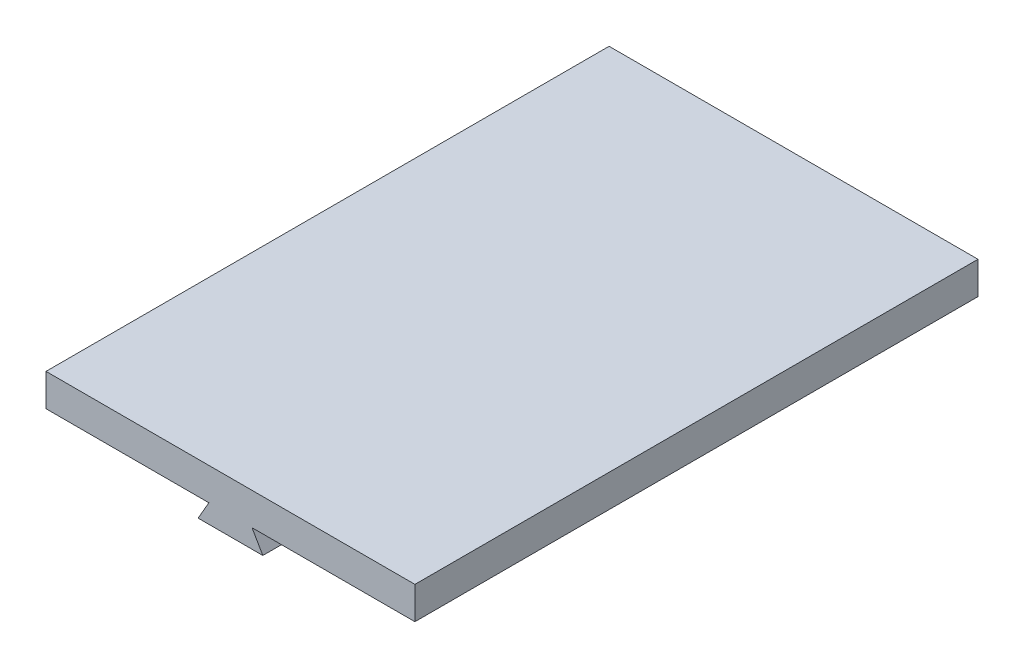
ISO-10303-21;
HEADER;
FILE_DESCRIPTION(('STEP AP214'),'2;1');
FILE_NAME('part.step','',(''),(''),'','','');
FILE_SCHEMA(('AUTOMOTIVE_DESIGN { 1 0 10303 214 1 1 1 1 }'));
ENDSEC;
DATA;
#1=APPLICATION_CONTEXT('core data for automotive mechanical design processes');
#2=APPLICATION_PROTOCOL_DEFINITION('international standard','automotive_design',2000,#1);
#3=PRODUCT_CONTEXT('',#1,'mechanical');
#4=PRODUCT('Part','Part','',(#3));
#5=PRODUCT_RELATED_PRODUCT_CATEGORY('part','',(#4));
#6=PRODUCT_DEFINITION_FORMATION('','',#4);
#7=PRODUCT_DEFINITION_CONTEXT('part definition',#1,'design');
#8=PRODUCT_DEFINITION('design','',#6,#7);
#9=PRODUCT_DEFINITION_SHAPE('','',#8);
#10=(LENGTH_UNIT() NAMED_UNIT(*) SI_UNIT(.MILLI.,.METRE.));
#11=(NAMED_UNIT(*) PLANE_ANGLE_UNIT() SI_UNIT($,.RADIAN.));
#12=(NAMED_UNIT(*) SI_UNIT($,.STERADIAN.) SOLID_ANGLE_UNIT());
#13=UNCERTAINTY_MEASURE_WITH_UNIT(LENGTH_MEASURE(1.E-05),#10,'distance_accuracy_value','');
#14=(GEOMETRIC_REPRESENTATION_CONTEXT(3) GLOBAL_UNCERTAINTY_ASSIGNED_CONTEXT((#13)) GLOBAL_UNIT_ASSIGNED_CONTEXT((#10,
#11,#12)) REPRESENTATION_CONTEXT('',''));
#15=CARTESIAN_POINT('',(0.,0.,0.));
#16=DIRECTION('',(0.,0.,1.));
#17=DIRECTION('',(1.,0.,0.));
#18=AXIS2_PLACEMENT_3D('',#15,#16,#17);
#19=CARTESIAN_POINT('',(-28.5,5.,43.5));
#20=DIRECTION('',(-1.,0.,0.));
#21=DIRECTION('',(0.,0.,1.));
#22=AXIS2_PLACEMENT_3D('',#19,#20,#21);
#23=PLANE('',#22);
#24=DIRECTION('',(0.,0.,-1.));
#25=VECTOR('',#24,1.);
#26=CARTESIAN_POINT('',(-28.5,0.,43.5));
#27=LINE('',#26,#25);
#28=CARTESIAN_POINT('',(-28.5,0.,43.5));
#29=VERTEX_POINT('',#28);
#30=CARTESIAN_POINT('',(-28.5,0.,-43.5));
#31=VERTEX_POINT('',#30);
#32=EDGE_CURVE('E181',#29,#31,#27,.T.);
#33=ORIENTED_EDGE('',*,*,#32,.F.);
#34=DIRECTION('',(0.,-1.,0.));
#35=VECTOR('',#34,1.);
#36=CARTESIAN_POINT('',(-28.5,5.,43.5));
#37=LINE('',#36,#35);
#38=CARTESIAN_POINT('',(-28.5,5.,43.5));
#39=VERTEX_POINT('',#38);
#40=EDGE_CURVE('E11',#39,#29,#37,.T.);
#41=ORIENTED_EDGE('',*,*,#40,.F.);
#42=DIRECTION('',(0.,0.,-1.));
#43=VECTOR('',#42,1.);
#44=CARTESIAN_POINT('',(-28.5,5.,43.5));
#45=LINE('',#44,#43);
#46=CARTESIAN_POINT('',(-28.5,5.,-43.5));
#47=VERTEX_POINT('',#46);
#48=EDGE_CURVE('E188',#39,#47,#45,.T.);
#49=ORIENTED_EDGE('',*,*,#48,.T.);
#50=DIRECTION('',(0.,-1.,0.));
#51=VECTOR('',#50,1.);
#52=CARTESIAN_POINT('',(-28.5,5.,-43.5));
#53=LINE('',#52,#51);
#54=EDGE_CURVE('E38',#47,#31,#53,.T.);
#55=ORIENTED_EDGE('',*,*,#54,.T.);
#56=EDGE_LOOP('',(#33,#41,#49,#55));
#57=FACE_BOUND('',#56,.T.);
#58=ADVANCED_FACE('F35',(#57),#23,.T.);
#59=CARTESIAN_POINT('',(-28.5,5.,43.5));
#60=DIRECTION('',(0.,0.,-1.));
#61=DIRECTION('',(-1.,0.,0.));
#62=AXIS2_PLACEMENT_3D('',#59,#60,#61);
#63=PLANE('',#62);
#64=DIRECTION('',(1.,0.,0.));
#65=VECTOR('',#64,1.);
#66=CARTESIAN_POINT('',(-28.5,0.,43.5));
#67=LINE('',#66,#65);
#68=CARTESIAN_POINT('',(-3.33333333333333,0.,43.5));
#69=VERTEX_POINT('',#68);
#70=EDGE_CURVE('E192',#29,#69,#67,.T.);
#71=ORIENTED_EDGE('',*,*,#70,.T.);
#72=DIRECTION('',(-0.5,-0.866025403784439,0.));
#73=VECTOR('',#72,1.);
#74=CARTESIAN_POINT('',(-2.5,1.44337567297406,43.5));
#75=LINE('',#74,#73);
#76=CARTESIAN_POINT('',(-5.,-2.88675134594813,43.5));
#77=VERTEX_POINT('',#76);
#78=EDGE_CURVE('E163',#69,#77,#75,.T.);
#79=ORIENTED_EDGE('',*,*,#78,.T.);
#80=DIRECTION('',(1.,0.,0.));
#81=VECTOR('',#80,1.);
#82=CARTESIAN_POINT('',(0.,-2.88675134594813,43.5));
#83=LINE('',#82,#81);
#84=CARTESIAN_POINT('',(5.,-2.88675134594813,43.5));
#85=VERTEX_POINT('',#84);
#86=EDGE_CURVE('E158',#77,#85,#83,.T.);
#87=ORIENTED_EDGE('',*,*,#86,.T.);
#88=DIRECTION('',(-0.5,0.866025403784439,0.));
#89=VECTOR('',#88,1.);
#90=CARTESIAN_POINT('',(2.5,1.44337567297406,43.5));
#91=LINE('',#90,#89);
#92=CARTESIAN_POINT('',(3.33333333333333,0.,43.5));
#93=VERTEX_POINT('',#92);
#94=EDGE_CURVE('E174',#85,#93,#91,.T.);
#95=ORIENTED_EDGE('',*,*,#94,.T.);
#96=CARTESIAN_POINT('',(28.5,0.,43.5));
#97=VERTEX_POINT('',#96);
#98=EDGE_CURVE('E207',#93,#97,#67,.T.);
#99=ORIENTED_EDGE('',*,*,#98,.T.);
#100=DIRECTION('',(0.,-1.,0.));
#101=VECTOR('',#100,1.);
#102=CARTESIAN_POINT('',(28.5,5.,43.5));
#103=LINE('',#102,#101);
#104=CARTESIAN_POINT('',(28.5,5.,43.5));
#105=VERTEX_POINT('',#104);
#106=EDGE_CURVE('E43',#105,#97,#103,.T.);
#107=ORIENTED_EDGE('',*,*,#106,.F.);
#108=DIRECTION('',(1.,0.,0.));
#109=VECTOR('',#108,1.);
#110=CARTESIAN_POINT('',(-28.5,5.,43.5));
#111=LINE('',#110,#109);
#112=EDGE_CURVE('E197',#39,#105,#111,.T.);
#113=ORIENTED_EDGE('',*,*,#112,.F.);
#114=ORIENTED_EDGE('',*,*,#40,.T.);
#115=EDGE_LOOP('',(#71,#79,#87,#95,#99,#107,#113,#114));
#116=FACE_BOUND('',#115,.T.);
#117=ADVANCED_FACE('F225',(#116),#63,.F.);
#118=CARTESIAN_POINT('',(28.5,5.,43.5));
#119=DIRECTION('',(-1.,0.,0.));
#120=DIRECTION('',(0.,0.,1.));
#121=AXIS2_PLACEMENT_3D('',#118,#119,#120);
#122=PLANE('',#121);
#123=DIRECTION('',(0.,0.,-1.));
#124=VECTOR('',#123,1.);
#125=CARTESIAN_POINT('',(28.5,0.,43.5));
#126=LINE('',#125,#124);
#127=CARTESIAN_POINT('',(28.5,0.,-43.5));
#128=VERTEX_POINT('',#127);
#129=EDGE_CURVE('E204',#97,#128,#126,.T.);
#130=ORIENTED_EDGE('',*,*,#129,.T.);
#131=DIRECTION('',(0.,-1.,0.));
#132=VECTOR('',#131,1.);
#133=CARTESIAN_POINT('',(28.5,5.,-43.5));
#134=LINE('',#133,#132);
#135=CARTESIAN_POINT('',(28.5,5.,-43.5));
#136=VERTEX_POINT('',#135);
#137=EDGE_CURVE('E211',#136,#128,#134,.T.);
#138=ORIENTED_EDGE('',*,*,#137,.F.);
#139=DIRECTION('',(0.,0.,-1.));
#140=VECTOR('',#139,1.);
#141=CARTESIAN_POINT('',(28.5,5.,43.5));
#142=LINE('',#141,#140);
#143=EDGE_CURVE('E195',#105,#136,#142,.T.);
#144=ORIENTED_EDGE('',*,*,#143,.F.);
#145=ORIENTED_EDGE('',*,*,#106,.T.);
#146=EDGE_LOOP('',(#130,#138,#144,#145));
#147=FACE_BOUND('',#146,.T.);
#148=ADVANCED_FACE('F232',(#147),#122,.F.);
#149=CARTESIAN_POINT('',(-28.5,5.,-43.5));
#150=DIRECTION('',(0.,0.,-1.));
#151=DIRECTION('',(-1.,0.,0.));
#152=AXIS2_PLACEMENT_3D('',#149,#150,#151);
#153=PLANE('',#152);
#154=DIRECTION('',(1.,0.,0.));
#155=VECTOR('',#154,1.);
#156=CARTESIAN_POINT('',(-28.5,0.,-43.5));
#157=LINE('',#156,#155);
#158=CARTESIAN_POINT('',(-3.33333333333334,0.,-43.5));
#159=VERTEX_POINT('',#158);
#160=EDGE_CURVE('E202',#31,#159,#157,.T.);
#161=ORIENTED_EDGE('',*,*,#160,.F.);
#162=ORIENTED_EDGE('',*,*,#54,.F.);
#163=DIRECTION('',(1.,0.,0.));
#164=VECTOR('',#163,1.);
#165=CARTESIAN_POINT('',(-28.5,5.,-43.5));
#166=LINE('',#165,#164);
#167=EDGE_CURVE('E191',#47,#136,#166,.T.);
#168=ORIENTED_EDGE('',*,*,#167,.T.);
#169=ORIENTED_EDGE('',*,*,#137,.T.);
#170=CARTESIAN_POINT('',(3.33333333333333,0.,-43.5));
#171=VERTEX_POINT('',#170);
#172=EDGE_CURVE('E201',#171,#128,#157,.T.);
#173=ORIENTED_EDGE('',*,*,#172,.F.);
#174=DIRECTION('',(0.5,-0.866025403784439,0.));
#175=VECTOR('',#174,1.);
#176=CARTESIAN_POINT('',(-6.7900635094611,17.5342376769023,-43.5));
#177=LINE('',#176,#175);
#178=CARTESIAN_POINT('',(5.,-2.88675134594813,-43.5));
#179=VERTEX_POINT('',#178);
#180=EDGE_CURVE('E152',#171,#179,#177,.T.);
#181=ORIENTED_EDGE('',*,*,#180,.T.);
#182=DIRECTION('',(-1.,0.,0.));
#183=VECTOR('',#182,1.);
#184=CARTESIAN_POINT('',(-28.5,-2.88675134594814,-43.5));
#185=LINE('',#184,#183);
#186=CARTESIAN_POINT('',(-5.,-2.88675134594813,-43.5));
#187=VERTEX_POINT('',#186);
#188=EDGE_CURVE('E150',#179,#187,#185,.T.);
#189=ORIENTED_EDGE('',*,*,#188,.T.);
#190=DIRECTION('',(0.5,0.866025403784439,0.));
#191=VECTOR('',#190,1.);
#192=CARTESIAN_POINT('',(-7.45993649053891,-7.14748633095419,-43.5));
#193=LINE('',#192,#191);
#194=EDGE_CURVE('E128',#187,#159,#193,.T.);
#195=ORIENTED_EDGE('',*,*,#194,.T.);
#196=EDGE_LOOP('',(#161,#162,#168,#169,#173,#181,#189,#195));
#197=FACE_BOUND('',#196,.T.);
#198=ADVANCED_FACE('F220',(#197),#153,.T.);
#199=CARTESIAN_POINT('',(0.,5.,0.));
#200=DIRECTION('',(0.,-1.,0.));
#201=DIRECTION('',(0.,0.,-1.));
#202=AXIS2_PLACEMENT_3D('',#199,#200,#201);
#203=PLANE('',#202);
#204=ORIENTED_EDGE('',*,*,#48,.F.);
#205=ORIENTED_EDGE('',*,*,#112,.T.);
#206=ORIENTED_EDGE('',*,*,#143,.T.);
#207=ORIENTED_EDGE('',*,*,#167,.F.);
#208=EDGE_LOOP('',(#204,#205,#206,#207));
#209=FACE_BOUND('',#208,.T.);
#210=ADVANCED_FACE('F230',(#209),#203,.F.);
#211=CARTESIAN_POINT('',(0.,0.,0.));
#212=DIRECTION('',(0.,-1.,0.));
#213=DIRECTION('',(0.,0.,-1.));
#214=AXIS2_PLACEMENT_3D('',#211,#212,#213);
#215=PLANE('',#214);
#216=DIRECTION('',(0.,0.,-1.));
#217=VECTOR('',#216,1.);
#218=CARTESIAN_POINT('',(-3.33333333333333,0.,-38.5));
#219=LINE('',#218,#217);
#220=CARTESIAN_POINT('',(-3.33333333333333,0.,-38.5));
#221=VERTEX_POINT('',#220);
#222=EDGE_CURVE('E56',#221,#159,#219,.T.);
#223=ORIENTED_EDGE('',*,*,#222,.F.);
#224=DIRECTION('',(-1.,0.,0.));
#225=VECTOR('',#224,1.);
#226=CARTESIAN_POINT('',(-28.5,0.,-38.5));
#227=LINE('',#226,#225);
#228=CARTESIAN_POINT('',(3.33333333333333,0.,-38.5));
#229=VERTEX_POINT('',#228);
#230=EDGE_CURVE('E51',#229,#221,#227,.T.);
#231=ORIENTED_EDGE('',*,*,#230,.F.);
#232=DIRECTION('',(0.,0.,-1.));
#233=VECTOR('',#232,1.);
#234=CARTESIAN_POINT('',(3.33333333333333,0.,-38.5));
#235=LINE('',#234,#233);
#236=EDGE_CURVE('E145',#229,#171,#235,.T.);
#237=ORIENTED_EDGE('',*,*,#236,.T.);
#238=ORIENTED_EDGE('',*,*,#172,.T.);
#239=ORIENTED_EDGE('',*,*,#129,.F.);
#240=ORIENTED_EDGE('',*,*,#98,.F.);
#241=DIRECTION('',(0.,0.,1.));
#242=VECTOR('',#241,1.);
#243=CARTESIAN_POINT('',(3.33333333333333,0.,38.5));
#244=LINE('',#243,#242);
#245=CARTESIAN_POINT('',(3.33333333333333,0.,38.5));
#246=VERTEX_POINT('',#245);
#247=EDGE_CURVE('E185',#246,#93,#244,.T.);
#248=ORIENTED_EDGE('',*,*,#247,.F.);
#249=DIRECTION('',(1.,0.,0.));
#250=VECTOR('',#249,1.);
#251=CARTESIAN_POINT('',(0.,0.,38.5));
#252=LINE('',#251,#250);
#253=CARTESIAN_POINT('',(-3.33333333333333,0.,38.5));
#254=VERTEX_POINT('',#253);
#255=EDGE_CURVE('E166',#254,#246,#252,.T.);
#256=ORIENTED_EDGE('',*,*,#255,.F.);
#257=DIRECTION('',(0.,0.,1.));
#258=VECTOR('',#257,1.);
#259=CARTESIAN_POINT('',(-3.33333333333333,0.,38.5));
#260=LINE('',#259,#258);
#261=EDGE_CURVE('E182',#254,#69,#260,.T.);
#262=ORIENTED_EDGE('',*,*,#261,.T.);
#263=ORIENTED_EDGE('',*,*,#70,.F.);
#264=ORIENTED_EDGE('',*,*,#32,.T.);
#265=ORIENTED_EDGE('',*,*,#160,.T.);
#266=EDGE_LOOP('',(#223,#231,#237,#238,#239,#240,#248,#256,#262,#263,#264,#265));
#267=FACE_BOUND('',#266,.T.);
#268=ADVANCED_FACE('F222',(#267),#215,.T.);
#269=CARTESIAN_POINT('',(0.,-2.88675134594813,38.5));
#270=DIRECTION('',(0.,-1.,0.));
#271=DIRECTION('',(1.,0.,0.));
#272=AXIS2_PLACEMENT_3D('',#269,#270,#271);
#273=PLANE('',#272);
#274=ORIENTED_EDGE('',*,*,#86,.F.);
#275=DIRECTION('',(0.,0.,1.));
#276=VECTOR('',#275,1.);
#277=CARTESIAN_POINT('',(-5.,-2.88675134594813,38.5));
#278=LINE('',#277,#276);
#279=CARTESIAN_POINT('',(-5.,-2.88675134594813,38.5));
#280=VERTEX_POINT('',#279);
#281=EDGE_CURVE('E179',#280,#77,#278,.T.);
#282=ORIENTED_EDGE('',*,*,#281,.F.);
#283=DIRECTION('',(1.,0.,0.));
#284=VECTOR('',#283,1.);
#285=CARTESIAN_POINT('',(0.,-2.88675134594813,38.5));
#286=LINE('',#285,#284);
#287=CARTESIAN_POINT('',(5.,-2.88675134594813,38.5));
#288=VERTEX_POINT('',#287);
#289=EDGE_CURVE('E159',#280,#288,#286,.T.);
#290=ORIENTED_EDGE('',*,*,#289,.T.);
#291=DIRECTION('',(0.,0.,1.));
#292=VECTOR('',#291,1.);
#293=CARTESIAN_POINT('',(5.,-2.88675134594813,38.5));
#294=LINE('',#293,#292);
#295=EDGE_CURVE('E171',#288,#85,#294,.T.);
#296=ORIENTED_EDGE('',*,*,#295,.T.);
#297=EDGE_LOOP('',(#274,#282,#290,#296));
#298=FACE_BOUND('',#297,.T.);
#299=ADVANCED_FACE('F265',(#298),#273,.T.);
#300=CARTESIAN_POINT('',(-2.5,1.44337567297406,38.5));
#301=DIRECTION('',(-0.866025403784438,0.5,0.));
#302=DIRECTION('',(-0.5,-0.866025403784438,0.));
#303=AXIS2_PLACEMENT_3D('',#300,#301,#302);
#304=PLANE('',#303);
#305=ORIENTED_EDGE('',*,*,#78,.F.);
#306=ORIENTED_EDGE('',*,*,#261,.F.);
#307=DIRECTION('',(-0.5,-0.866025403784439,0.));
#308=VECTOR('',#307,1.);
#309=CARTESIAN_POINT('',(-2.5,1.44337567297406,38.5));
#310=LINE('',#309,#308);
#311=EDGE_CURVE('E168',#254,#280,#310,.T.);
#312=ORIENTED_EDGE('',*,*,#311,.T.);
#313=ORIENTED_EDGE('',*,*,#281,.T.);
#314=EDGE_LOOP('',(#305,#306,#312,#313));
#315=FACE_BOUND('',#314,.T.);
#316=ADVANCED_FACE('F269',(#315),#304,.T.);
#317=CARTESIAN_POINT('',(2.5,1.44337567297406,38.5));
#318=DIRECTION('',(0.866025403784439,0.5,0.));
#319=DIRECTION('',(-0.5,0.866025403784439,0.));
#320=AXIS2_PLACEMENT_3D('',#317,#318,#319);
#321=PLANE('',#320);
#322=ORIENTED_EDGE('',*,*,#94,.F.);
#323=ORIENTED_EDGE('',*,*,#295,.F.);
#324=DIRECTION('',(-0.5,0.866025403784439,0.));
#325=VECTOR('',#324,1.);
#326=CARTESIAN_POINT('',(2.5,1.44337567297406,38.5));
#327=LINE('',#326,#325);
#328=EDGE_CURVE('E162',#288,#246,#327,.T.);
#329=ORIENTED_EDGE('',*,*,#328,.T.);
#330=ORIENTED_EDGE('',*,*,#247,.T.);
#331=EDGE_LOOP('',(#322,#323,#329,#330));
#332=FACE_BOUND('',#331,.T.);
#333=ADVANCED_FACE('F271',(#332),#321,.T.);
#334=CARTESIAN_POINT('',(0.,0.,38.5));
#335=DIRECTION('',(0.,0.,1.));
#336=DIRECTION('',(1.,0.,0.));
#337=AXIS2_PLACEMENT_3D('',#334,#335,#336);
#338=PLANE('',#337);
#339=ORIENTED_EDGE('',*,*,#289,.F.);
#340=ORIENTED_EDGE('',*,*,#311,.F.);
#341=ORIENTED_EDGE('',*,*,#255,.T.);
#342=ORIENTED_EDGE('',*,*,#328,.F.);
#343=EDGE_LOOP('',(#339,#340,#341,#342));
#344=FACE_BOUND('',#343,.T.);
#345=ADVANCED_FACE('F274',(#344),#338,.F.);
#346=CARTESIAN_POINT('',(-7.45993649053891,-7.14748633095419,-38.5));
#347=DIRECTION('',(-0.866025403784438,0.5,0.));
#348=DIRECTION('',(-0.5,-0.866025403784438,0.));
#349=AXIS2_PLACEMENT_3D('',#346,#347,#348);
#350=PLANE('',#349);
#351=ORIENTED_EDGE('',*,*,#194,.F.);
#352=DIRECTION('',(0.,0.,-1.));
#353=VECTOR('',#352,1.);
#354=CARTESIAN_POINT('',(-5.,-2.88675134594813,-38.5));
#355=LINE('',#354,#353);
#356=CARTESIAN_POINT('',(-5.,-2.88675134594813,-38.5));
#357=VERTEX_POINT('',#356);
#358=EDGE_CURVE('E123',#357,#187,#355,.T.);
#359=ORIENTED_EDGE('',*,*,#358,.F.);
#360=DIRECTION('',(0.5,0.866025403784439,0.));
#361=VECTOR('',#360,1.);
#362=CARTESIAN_POINT('',(-7.45993649053891,-7.14748633095419,-38.5));
#363=LINE('',#362,#361);
#364=EDGE_CURVE('E126',#357,#221,#363,.T.);
#365=ORIENTED_EDGE('',*,*,#364,.T.);
#366=ORIENTED_EDGE('',*,*,#222,.T.);
#367=EDGE_LOOP('',(#351,#359,#365,#366));
#368=FACE_BOUND('',#367,.T.);
#369=ADVANCED_FACE('F125',(#368),#350,.T.);
#370=CARTESIAN_POINT('',(-28.5,-2.88675134594814,-38.5));
#371=DIRECTION('',(0.,-1.,0.));
#372=DIRECTION('',(1.,0.,0.));
#373=AXIS2_PLACEMENT_3D('',#370,#371,#372);
#374=PLANE('',#373);
#375=ORIENTED_EDGE('',*,*,#188,.F.);
#376=DIRECTION('',(0.,0.,-1.));
#377=VECTOR('',#376,1.);
#378=CARTESIAN_POINT('',(5.,-2.88675134594813,-38.5));
#379=LINE('',#378,#377);
#380=CARTESIAN_POINT('',(5.,-2.88675134594813,-38.5));
#381=VERTEX_POINT('',#380);
#382=EDGE_CURVE('E133',#381,#179,#379,.T.);
#383=ORIENTED_EDGE('',*,*,#382,.F.);
#384=DIRECTION('',(-1.,0.,0.));
#385=VECTOR('',#384,1.);
#386=CARTESIAN_POINT('',(-28.5,-2.88675134594814,-38.5));
#387=LINE('',#386,#385);
#388=EDGE_CURVE('E139',#381,#357,#387,.T.);
#389=ORIENTED_EDGE('',*,*,#388,.T.);
#390=ORIENTED_EDGE('',*,*,#358,.T.);
#391=EDGE_LOOP('',(#375,#383,#389,#390));
#392=FACE_BOUND('',#391,.T.);
#393=ADVANCED_FACE('F142',(#392),#374,.T.);
#394=CARTESIAN_POINT('',(-6.7900635094611,17.5342376769023,-38.5));
#395=DIRECTION('',(0.866025403784439,0.5,0.));
#396=DIRECTION('',(-0.5,0.866025403784439,0.));
#397=AXIS2_PLACEMENT_3D('',#394,#395,#396);
#398=PLANE('',#397);
#399=ORIENTED_EDGE('',*,*,#180,.F.);
#400=ORIENTED_EDGE('',*,*,#236,.F.);
#401=DIRECTION('',(0.5,-0.866025403784439,0.));
#402=VECTOR('',#401,1.);
#403=CARTESIAN_POINT('',(-6.7900635094611,17.5342376769023,-38.5));
#404=LINE('',#403,#402);
#405=EDGE_CURVE('E143',#229,#381,#404,.T.);
#406=ORIENTED_EDGE('',*,*,#405,.T.);
#407=ORIENTED_EDGE('',*,*,#382,.T.);
#408=EDGE_LOOP('',(#399,#400,#406,#407));
#409=FACE_BOUND('',#408,.T.);
#410=ADVANCED_FACE('F238',(#409),#398,.T.);
#411=CARTESIAN_POINT('',(0.,0.,-38.5));
#412=DIRECTION('',(0.,0.,-1.));
#413=DIRECTION('',(-1.,0.,0.));
#414=AXIS2_PLACEMENT_3D('',#411,#412,#413);
#415=PLANE('',#414);
#416=ORIENTED_EDGE('',*,*,#230,.T.);
#417=ORIENTED_EDGE('',*,*,#364,.F.);
#418=ORIENTED_EDGE('',*,*,#388,.F.);
#419=ORIENTED_EDGE('',*,*,#405,.F.);
#420=EDGE_LOOP('',(#416,#417,#418,#419));
#421=FACE_BOUND('',#420,.T.);
#422=ADVANCED_FACE('F137',(#421),#415,.F.);
#423=CLOSED_SHELL('',(#58,#117,#148,#198,#210,#268,#299,#316,#333,#345,#369,#393,#410,#422));
#424=MANIFOLD_SOLID_BREP('B2',#423);
#425=ADVANCED_BREP_SHAPE_REPRESENTATION('',(#18,#424),#14);
#426=SHAPE_DEFINITION_REPRESENTATION(#9,#425);
ENDSEC;
END-ISO-10303-21;
